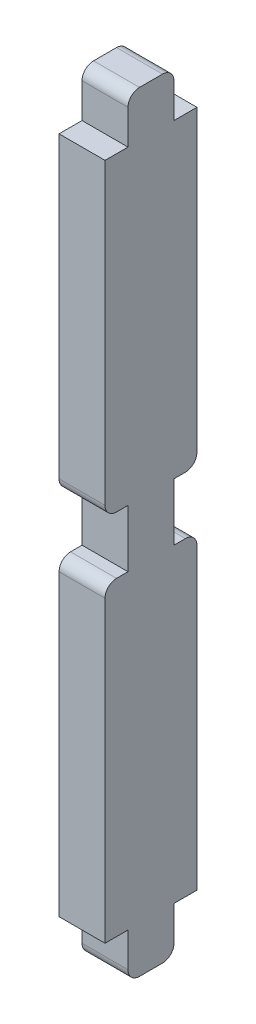
ISO-10303-21;
HEADER;
FILE_DESCRIPTION(('STEP AP214'),'2;1');
FILE_NAME('part.step','',(''),(''),'','','');
FILE_SCHEMA(('AUTOMOTIVE_DESIGN { 1 0 10303 214 1 1 1 1 }'));
ENDSEC;
DATA;
#1=APPLICATION_CONTEXT('core data for automotive mechanical design processes');
#2=APPLICATION_PROTOCOL_DEFINITION('international standard','automotive_design',2000,#1);
#3=PRODUCT_CONTEXT('',#1,'mechanical');
#4=PRODUCT('Part','Part','',(#3));
#5=PRODUCT_RELATED_PRODUCT_CATEGORY('part','',(#4));
#6=PRODUCT_DEFINITION_FORMATION('','',#4);
#7=PRODUCT_DEFINITION_CONTEXT('part definition',#1,'design');
#8=PRODUCT_DEFINITION('design','',#6,#7);
#9=PRODUCT_DEFINITION_SHAPE('','',#8);
#10=(LENGTH_UNIT() NAMED_UNIT(*) SI_UNIT(.MILLI.,.METRE.));
#11=(NAMED_UNIT(*) PLANE_ANGLE_UNIT() SI_UNIT($,.RADIAN.));
#12=(NAMED_UNIT(*) SI_UNIT($,.STERADIAN.) SOLID_ANGLE_UNIT());
#13=UNCERTAINTY_MEASURE_WITH_UNIT(LENGTH_MEASURE(1.E-05),#10,'distance_accuracy_value','');
#14=(GEOMETRIC_REPRESENTATION_CONTEXT(3) GLOBAL_UNCERTAINTY_ASSIGNED_CONTEXT((#13)) GLOBAL_UNIT_ASSIGNED_CONTEXT((#10,
#11,#12)) REPRESENTATION_CONTEXT('',''));
#15=CARTESIAN_POINT('',(0.,0.,0.));
#16=DIRECTION('',(0.,0.,1.));
#17=DIRECTION('',(1.,0.,0.));
#18=AXIS2_PLACEMENT_3D('',#15,#16,#17);
#19=CARTESIAN_POINT('',(4.,-29.5,-2.));
#20=DIRECTION('',(0.,0.,1.));
#21=DIRECTION('',(1.,0.,0.));
#22=AXIS2_PLACEMENT_3D('',#19,#20,#21);
#23=PLANE('',#22);
#24=DIRECTION('',(0.,1.,0.));
#25=VECTOR('',#24,1.);
#26=CARTESIAN_POINT('',(4.,-29.5,-2.));
#27=LINE('',#26,#25);
#28=CARTESIAN_POINT('',(4.,-32.5,-2.));
#29=VERTEX_POINT('',#28);
#30=CARTESIAN_POINT('',(4.,-29.5,-2.));
#31=VERTEX_POINT('',#30);
#32=EDGE_CURVE('E222',#29,#31,#27,.T.);
#33=ORIENTED_EDGE('',*,*,#32,.F.);
#34=DIRECTION('',(-1.,0.,0.));
#35=VECTOR('',#34,1.);
#36=CARTESIAN_POINT('',(4.,-32.5,-2.));
#37=LINE('',#36,#35);
#38=CARTESIAN_POINT('',(0.,-32.5,-2.));
#39=VERTEX_POINT('',#38);
#40=EDGE_CURVE('E309',#29,#39,#37,.T.);
#41=ORIENTED_EDGE('',*,*,#40,.T.);
#42=DIRECTION('',(0.,1.,0.));
#43=VECTOR('',#42,1.);
#44=CARTESIAN_POINT('',(0.,-29.5,-2.));
#45=LINE('',#44,#43);
#46=CARTESIAN_POINT('',(0.,-29.5,-2.));
#47=VERTEX_POINT('',#46);
#48=EDGE_CURVE('E245',#39,#47,#45,.T.);
#49=ORIENTED_EDGE('',*,*,#48,.T.);
#50=DIRECTION('',(-1.,0.,0.));
#51=VECTOR('',#50,1.);
#52=CARTESIAN_POINT('',(4.,-29.5,-2.));
#53=LINE('',#52,#51);
#54=EDGE_CURVE('E238',#31,#47,#53,.T.);
#55=ORIENTED_EDGE('',*,*,#54,.F.);
#56=EDGE_LOOP('',(#33,#41,#49,#55));
#57=FACE_BOUND('',#56,.T.);
#58=ADVANCED_FACE('F39',(#57),#23,.F.);
#59=CARTESIAN_POINT('',(4.,-29.5,-4.));
#60=DIRECTION('',(0.,1.,0.));
#61=DIRECTION('',(0.,0.,1.));
#62=AXIS2_PLACEMENT_3D('',#59,#60,#61);
#63=PLANE('',#62);
#64=DIRECTION('',(0.,0.,-1.));
#65=VECTOR('',#64,1.);
#66=CARTESIAN_POINT('',(0.,-29.5,-4.));
#67=LINE('',#66,#65);
#68=CARTESIAN_POINT('',(0.,-29.5,-4.));
#69=VERTEX_POINT('',#68);
#70=EDGE_CURVE('E471',#47,#69,#67,.T.);
#71=ORIENTED_EDGE('',*,*,#70,.T.);
#72=DIRECTION('',(-1.,0.,0.));
#73=VECTOR('',#72,1.);
#74=CARTESIAN_POINT('',(4.,-29.5,-4.));
#75=LINE('',#74,#73);
#76=CARTESIAN_POINT('',(4.,-29.5,-4.));
#77=VERTEX_POINT('',#76);
#78=EDGE_CURVE('E240',#77,#69,#75,.T.);
#79=ORIENTED_EDGE('',*,*,#78,.F.);
#80=DIRECTION('',(0.,0.,-1.));
#81=VECTOR('',#80,1.);
#82=CARTESIAN_POINT('',(4.,-29.5,-4.));
#83=LINE('',#82,#81);
#84=EDGE_CURVE('E227',#31,#77,#83,.T.);
#85=ORIENTED_EDGE('',*,*,#84,.F.);
#86=ORIENTED_EDGE('',*,*,#54,.T.);
#87=EDGE_LOOP('',(#71,#79,#85,#86));
#88=FACE_BOUND('',#87,.T.);
#89=ADVANCED_FACE('F237',(#88),#63,.F.);
#90=CARTESIAN_POINT('',(4.,-2.5,-4.));
#91=DIRECTION('',(0.,0.,1.));
#92=DIRECTION('',(0.,-1.,0.));
#93=AXIS2_PLACEMENT_3D('',#90,#91,#92);
#94=PLANE('',#93);
#95=DIRECTION('',(0.,1.,0.));
#96=VECTOR('',#95,1.);
#97=CARTESIAN_POINT('',(0.,-2.5,-4.));
#98=LINE('',#97,#96);
#99=CARTESIAN_POINT('',(0.,-3.5,-4.));
#100=VERTEX_POINT('',#99);
#101=EDGE_CURVE('E418',#69,#100,#98,.T.);
#102=ORIENTED_EDGE('',*,*,#101,.T.);
#103=DIRECTION('',(-1.,0.,0.));
#104=VECTOR('',#103,1.);
#105=CARTESIAN_POINT('',(4.,-3.5,-4.));
#106=LINE('',#105,#104);
#107=CARTESIAN_POINT('',(4.,-3.5,-4.));
#108=VERTEX_POINT('',#107);
#109=EDGE_CURVE('E276',#100,#108,#106,.F.);
#110=ORIENTED_EDGE('',*,*,#109,.T.);
#111=DIRECTION('',(0.,1.,0.));
#112=VECTOR('',#111,1.);
#113=CARTESIAN_POINT('',(4.,-2.5,-4.));
#114=LINE('',#113,#112);
#115=EDGE_CURVE('E242',#77,#108,#114,.T.);
#116=ORIENTED_EDGE('',*,*,#115,.F.);
#117=ORIENTED_EDGE('',*,*,#78,.T.);
#118=EDGE_LOOP('',(#102,#110,#116,#117));
#119=FACE_BOUND('',#118,.T.);
#120=ADVANCED_FACE('F476',(#119),#94,.F.);
#121=CARTESIAN_POINT('',(4.,-2.5,-2.));
#122=DIRECTION('',(0.,-1.,0.));
#123=DIRECTION('',(0.,0.,-1.));
#124=AXIS2_PLACEMENT_3D('',#121,#122,#123);
#125=PLANE('',#124);
#126=DIRECTION('',(0.,0.,1.));
#127=VECTOR('',#126,1.);
#128=CARTESIAN_POINT('',(4.,-2.5,-2.));
#129=LINE('',#128,#127);
#130=CARTESIAN_POINT('',(4.,-2.5,-3.));
#131=VERTEX_POINT('',#130);
#132=CARTESIAN_POINT('',(4.,-2.5,-2.));
#133=VERTEX_POINT('',#132);
#134=EDGE_CURVE('E443',#131,#133,#129,.T.);
#135=ORIENTED_EDGE('',*,*,#134,.F.);
#136=DIRECTION('',(-1.,0.,0.));
#137=VECTOR('',#136,1.);
#138=CARTESIAN_POINT('',(4.,-2.5,-3.));
#139=LINE('',#138,#137);
#140=CARTESIAN_POINT('',(0.,-2.5,-3.));
#141=VERTEX_POINT('',#140);
#142=EDGE_CURVE('E273',#131,#141,#139,.T.);
#143=ORIENTED_EDGE('',*,*,#142,.T.);
#144=DIRECTION('',(0.,0.,1.));
#145=VECTOR('',#144,1.);
#146=CARTESIAN_POINT('',(0.,-2.5,-2.));
#147=LINE('',#146,#145);
#148=CARTESIAN_POINT('',(0.,-2.5,-2.));
#149=VERTEX_POINT('',#148);
#150=EDGE_CURVE('E412',#141,#149,#147,.T.);
#151=ORIENTED_EDGE('',*,*,#150,.T.);
#152=DIRECTION('',(-1.,0.,0.));
#153=VECTOR('',#152,1.);
#154=CARTESIAN_POINT('',(4.,-2.5,-2.));
#155=LINE('',#154,#153);
#156=EDGE_CURVE('E252',#133,#149,#155,.T.);
#157=ORIENTED_EDGE('',*,*,#156,.F.);
#158=EDGE_LOOP('',(#135,#143,#151,#157));
#159=FACE_BOUND('',#158,.T.);
#160=ADVANCED_FACE('F481',(#159),#125,.F.);
#161=CARTESIAN_POINT('',(4.,2.5,-2.));
#162=DIRECTION('',(0.,0.,1.));
#163=DIRECTION('',(1.,0.,0.));
#164=AXIS2_PLACEMENT_3D('',#161,#162,#163);
#165=PLANE('',#164);
#166=DIRECTION('',(0.,1.,0.));
#167=VECTOR('',#166,1.);
#168=CARTESIAN_POINT('',(0.,2.5,-2.));
#169=LINE('',#168,#167);
#170=CARTESIAN_POINT('',(0.,2.5,-2.));
#171=VERTEX_POINT('',#170);
#172=EDGE_CURVE('E406',#149,#171,#169,.T.);
#173=ORIENTED_EDGE('',*,*,#172,.T.);
#174=DIRECTION('',(-1.,0.,0.));
#175=VECTOR('',#174,1.);
#176=CARTESIAN_POINT('',(4.,2.5,-2.));
#177=LINE('',#176,#175);
#178=CARTESIAN_POINT('',(4.,2.5,-2.));
#179=VERTEX_POINT('',#178);
#180=EDGE_CURVE('E397',#179,#171,#177,.T.);
#181=ORIENTED_EDGE('',*,*,#180,.F.);
#182=DIRECTION('',(0.,1.,0.));
#183=VECTOR('',#182,1.);
#184=CARTESIAN_POINT('',(4.,2.5,-2.));
#185=LINE('',#184,#183);
#186=EDGE_CURVE('E407',#133,#179,#185,.T.);
#187=ORIENTED_EDGE('',*,*,#186,.F.);
#188=ORIENTED_EDGE('',*,*,#156,.T.);
#189=EDGE_LOOP('',(#173,#181,#187,#188));
#190=FACE_BOUND('',#189,.T.);
#191=ADVANCED_FACE('F404',(#190),#165,.F.);
#192=CARTESIAN_POINT('',(4.,2.5,-4.));
#193=DIRECTION('',(0.,1.,0.));
#194=DIRECTION('',(0.,0.,1.));
#195=AXIS2_PLACEMENT_3D('',#192,#193,#194);
#196=PLANE('',#195);
#197=DIRECTION('',(0.,0.,-1.));
#198=VECTOR('',#197,1.);
#199=CARTESIAN_POINT('',(0.,2.5,-4.));
#200=LINE('',#199,#198);
#201=CARTESIAN_POINT('',(0.,2.5,-3.));
#202=VERTEX_POINT('',#201);
#203=EDGE_CURVE('E414',#171,#202,#200,.T.);
#204=ORIENTED_EDGE('',*,*,#203,.T.);
#205=DIRECTION('',(-1.,0.,0.));
#206=VECTOR('',#205,1.);
#207=CARTESIAN_POINT('',(4.,2.5,-3.));
#208=LINE('',#207,#206);
#209=CARTESIAN_POINT('',(4.,2.5,-3.));
#210=VERTEX_POINT('',#209);
#211=EDGE_CURVE('E263',#202,#210,#208,.F.);
#212=ORIENTED_EDGE('',*,*,#211,.T.);
#213=DIRECTION('',(0.,0.,-1.));
#214=VECTOR('',#213,1.);
#215=CARTESIAN_POINT('',(4.,2.5,-4.));
#216=LINE('',#215,#214);
#217=EDGE_CURVE('E440',#179,#210,#216,.T.);
#218=ORIENTED_EDGE('',*,*,#217,.F.);
#219=ORIENTED_EDGE('',*,*,#180,.T.);
#220=EDGE_LOOP('',(#204,#212,#218,#219));
#221=FACE_BOUND('',#220,.T.);
#222=ADVANCED_FACE('F439',(#221),#196,.F.);
#223=CARTESIAN_POINT('',(4.,29.5,-4.));
#224=DIRECTION('',(0.,0.,1.));
#225=DIRECTION('',(1.,0.,0.));
#226=AXIS2_PLACEMENT_3D('',#223,#224,#225);
#227=PLANE('',#226);
#228=DIRECTION('',(0.,1.,0.));
#229=VECTOR('',#228,1.);
#230=CARTESIAN_POINT('',(4.,29.5,-4.));
#231=LINE('',#230,#229);
#232=CARTESIAN_POINT('',(4.,3.5,-4.));
#233=VERTEX_POINT('',#232);
#234=CARTESIAN_POINT('',(4.,29.5,-4.));
#235=VERTEX_POINT('',#234);
#236=EDGE_CURVE('E431',#233,#235,#231,.T.);
#237=ORIENTED_EDGE('',*,*,#236,.F.);
#238=DIRECTION('',(-1.,0.,0.));
#239=VECTOR('',#238,1.);
#240=CARTESIAN_POINT('',(4.,3.5,-4.));
#241=LINE('',#240,#239);
#242=CARTESIAN_POINT('',(0.,3.5,-4.));
#243=VERTEX_POINT('',#242);
#244=EDGE_CURVE('E247',#233,#243,#241,.T.);
#245=ORIENTED_EDGE('',*,*,#244,.T.);
#246=DIRECTION('',(0.,1.,0.));
#247=VECTOR('',#246,1.);
#248=CARTESIAN_POINT('',(0.,29.5,-4.));
#249=LINE('',#248,#247);
#250=CARTESIAN_POINT('',(0.,29.5,-4.));
#251=VERTEX_POINT('',#250);
#252=EDGE_CURVE('E416',#243,#251,#249,.T.);
#253=ORIENTED_EDGE('',*,*,#252,.T.);
#254=DIRECTION('',(-1.,0.,0.));
#255=VECTOR('',#254,1.);
#256=CARTESIAN_POINT('',(4.,29.5,-4.));
#257=LINE('',#256,#255);
#258=EDGE_CURVE('E394',#235,#251,#257,.T.);
#259=ORIENTED_EDGE('',*,*,#258,.F.);
#260=EDGE_LOOP('',(#237,#245,#253,#259));
#261=FACE_BOUND('',#260,.T.);
#262=ADVANCED_FACE('F429',(#261),#227,.F.);
#263=CARTESIAN_POINT('',(4.,29.5,-2.));
#264=DIRECTION('',(0.,-1.,0.));
#265=DIRECTION('',(0.,0.,-1.));
#266=AXIS2_PLACEMENT_3D('',#263,#264,#265);
#267=PLANE('',#266);
#268=DIRECTION('',(0.,0.,1.));
#269=VECTOR('',#268,1.);
#270=CARTESIAN_POINT('',(0.,29.5,-2.));
#271=LINE('',#270,#269);
#272=CARTESIAN_POINT('',(0.,29.5,-2.));
#273=VERTEX_POINT('',#272);
#274=EDGE_CURVE('E349',#251,#273,#271,.T.);
#275=ORIENTED_EDGE('',*,*,#274,.T.);
#276=DIRECTION('',(-1.,0.,0.));
#277=VECTOR('',#276,1.);
#278=CARTESIAN_POINT('',(4.,29.5,-2.));
#279=LINE('',#278,#277);
#280=CARTESIAN_POINT('',(4.,29.5,-2.));
#281=VERTEX_POINT('',#280);
#282=EDGE_CURVE('E392',#281,#273,#279,.T.);
#283=ORIENTED_EDGE('',*,*,#282,.F.);
#284=DIRECTION('',(0.,0.,1.));
#285=VECTOR('',#284,1.);
#286=CARTESIAN_POINT('',(4.,29.5,-2.));
#287=LINE('',#286,#285);
#288=EDGE_CURVE('E329',#235,#281,#287,.T.);
#289=ORIENTED_EDGE('',*,*,#288,.F.);
#290=ORIENTED_EDGE('',*,*,#258,.T.);
#291=EDGE_LOOP('',(#275,#283,#289,#290));
#292=FACE_BOUND('',#291,.T.);
#293=ADVANCED_FACE('F424',(#292),#267,.F.);
#294=CARTESIAN_POINT('',(4.,33.5,-2.));
#295=DIRECTION('',(0.,0.,1.));
#296=DIRECTION('',(1.,0.,0.));
#297=AXIS2_PLACEMENT_3D('',#294,#295,#296);
#298=PLANE('',#297);
#299=DIRECTION('',(0.,1.,0.));
#300=VECTOR('',#299,1.);
#301=CARTESIAN_POINT('',(0.,33.5,-2.));
#302=LINE('',#301,#300);
#303=CARTESIAN_POINT('',(0.,32.5,-2.));
#304=VERTEX_POINT('',#303);
#305=EDGE_CURVE('E324',#273,#304,#302,.T.);
#306=ORIENTED_EDGE('',*,*,#305,.T.);
#307=DIRECTION('',(-1.,0.,0.));
#308=VECTOR('',#307,1.);
#309=CARTESIAN_POINT('',(4.,32.5,-2.));
#310=LINE('',#309,#308);
#311=CARTESIAN_POINT('',(4.,32.5,-2.));
#312=VERTEX_POINT('',#311);
#313=EDGE_CURVE('E47',#304,#312,#310,.F.);
#314=ORIENTED_EDGE('',*,*,#313,.T.);
#315=DIRECTION('',(0.,1.,0.));
#316=VECTOR('',#315,1.);
#317=CARTESIAN_POINT('',(4.,33.5,-2.));
#318=LINE('',#317,#316);
#319=EDGE_CURVE('E322',#281,#312,#318,.T.);
#320=ORIENTED_EDGE('',*,*,#319,.F.);
#321=ORIENTED_EDGE('',*,*,#282,.T.);
#322=EDGE_LOOP('',(#306,#314,#320,#321));
#323=FACE_BOUND('',#322,.T.);
#324=ADVANCED_FACE('F320',(#323),#298,.F.);
#325=CARTESIAN_POINT('',(4.,33.5,2.));
#326=DIRECTION('',(0.,-1.,0.));
#327=DIRECTION('',(0.,0.,-1.));
#328=AXIS2_PLACEMENT_3D('',#325,#326,#327);
#329=PLANE('',#328);
#330=DIRECTION('',(0.,0.,1.));
#331=VECTOR('',#330,1.);
#332=CARTESIAN_POINT('',(4.,33.5,2.));
#333=LINE('',#332,#331);
#334=CARTESIAN_POINT('',(4.,33.5,-1.));
#335=VERTEX_POINT('',#334);
#336=CARTESIAN_POINT('',(4.,33.5,0.999999999999998));
#337=VERTEX_POINT('',#336);
#338=EDGE_CURVE('E331',#335,#337,#333,.T.);
#339=ORIENTED_EDGE('',*,*,#338,.F.);
#340=DIRECTION('',(-1.,0.,0.));
#341=VECTOR('',#340,1.);
#342=CARTESIAN_POINT('',(4.,33.5,-1.));
#343=LINE('',#342,#341);
#344=CARTESIAN_POINT('',(0.,33.5,-1.));
#345=VERTEX_POINT('',#344);
#346=EDGE_CURVE('E313',#335,#345,#343,.T.);
#347=ORIENTED_EDGE('',*,*,#346,.T.);
#348=DIRECTION('',(0.,0.,1.));
#349=VECTOR('',#348,1.);
#350=CARTESIAN_POINT('',(0.,33.5,2.));
#351=LINE('',#350,#349);
#352=CARTESIAN_POINT('',(0.,33.5,0.999999999999998));
#353=VERTEX_POINT('',#352);
#354=EDGE_CURVE('E339',#345,#353,#351,.T.);
#355=ORIENTED_EDGE('',*,*,#354,.T.);
#356=DIRECTION('',(-1.,0.,0.));
#357=VECTOR('',#356,1.);
#358=CARTESIAN_POINT('',(4.,33.5,0.999999999999998));
#359=LINE('',#358,#357);
#360=EDGE_CURVE('E311',#353,#337,#359,.F.);
#361=ORIENTED_EDGE('',*,*,#360,.T.);
#362=EDGE_LOOP('',(#339,#347,#355,#361));
#363=FACE_BOUND('',#362,.T.);
#364=ADVANCED_FACE('F338',(#363),#329,.F.);
#365=CARTESIAN_POINT('',(4.,29.5,2.));
#366=DIRECTION('',(0.,0.,-1.));
#367=DIRECTION('',(-1.,0.,0.));
#368=AXIS2_PLACEMENT_3D('',#365,#366,#367);
#369=PLANE('',#368);
#370=DIRECTION('',(0.,-1.,0.));
#371=VECTOR('',#370,1.);
#372=CARTESIAN_POINT('',(4.,29.5,2.));
#373=LINE('',#372,#371);
#374=CARTESIAN_POINT('',(4.,32.5,2.));
#375=VERTEX_POINT('',#374);
#376=CARTESIAN_POINT('',(4.,29.5,2.));
#377=VERTEX_POINT('',#376);
#378=EDGE_CURVE('E449',#375,#377,#373,.T.);
#379=ORIENTED_EDGE('',*,*,#378,.F.);
#380=DIRECTION('',(-1.,0.,0.));
#381=VECTOR('',#380,1.);
#382=CARTESIAN_POINT('',(4.,32.5,2.));
#383=LINE('',#382,#381);
#384=CARTESIAN_POINT('',(0.,32.5,2.));
#385=VERTEX_POINT('',#384);
#386=EDGE_CURVE('E11',#375,#385,#383,.T.);
#387=ORIENTED_EDGE('',*,*,#386,.T.);
#388=DIRECTION('',(0.,-1.,0.));
#389=VECTOR('',#388,1.);
#390=CARTESIAN_POINT('',(0.,29.5,2.));
#391=LINE('',#390,#389);
#392=CARTESIAN_POINT('',(0.,29.5,2.));
#393=VERTEX_POINT('',#392);
#394=EDGE_CURVE('E345',#385,#393,#391,.T.);
#395=ORIENTED_EDGE('',*,*,#394,.T.);
#396=DIRECTION('',(-1.,0.,0.));
#397=VECTOR('',#396,1.);
#398=CARTESIAN_POINT('',(4.,29.5,2.));
#399=LINE('',#398,#397);
#400=EDGE_CURVE('E389',#377,#393,#399,.T.);
#401=ORIENTED_EDGE('',*,*,#400,.F.);
#402=EDGE_LOOP('',(#379,#387,#395,#401));
#403=FACE_BOUND('',#402,.T.);
#404=ADVANCED_FACE('F528',(#403),#369,.F.);
#405=CARTESIAN_POINT('',(4.,29.5,4.));
#406=DIRECTION('',(0.,-1.,0.));
#407=DIRECTION('',(0.,0.,-1.));
#408=AXIS2_PLACEMENT_3D('',#405,#406,#407);
#409=PLANE('',#408);
#410=DIRECTION('',(0.,0.,1.));
#411=VECTOR('',#410,1.);
#412=CARTESIAN_POINT('',(0.,29.5,4.));
#413=LINE('',#412,#411);
#414=CARTESIAN_POINT('',(0.,29.5,4.));
#415=VERTEX_POINT('',#414);
#416=EDGE_CURVE('E347',#393,#415,#413,.T.);
#417=ORIENTED_EDGE('',*,*,#416,.T.);
#418=DIRECTION('',(-1.,0.,0.));
#419=VECTOR('',#418,1.);
#420=CARTESIAN_POINT('',(4.,29.5,4.));
#421=LINE('',#420,#419);
#422=CARTESIAN_POINT('',(4.,29.5,4.));
#423=VERTEX_POINT('',#422);
#424=EDGE_CURVE('E386',#423,#415,#421,.T.);
#425=ORIENTED_EDGE('',*,*,#424,.F.);
#426=DIRECTION('',(0.,0.,1.));
#427=VECTOR('',#426,1.);
#428=CARTESIAN_POINT('',(4.,29.5,4.));
#429=LINE('',#428,#427);
#430=EDGE_CURVE('E451',#377,#423,#429,.T.);
#431=ORIENTED_EDGE('',*,*,#430,.F.);
#432=ORIENTED_EDGE('',*,*,#400,.T.);
#433=EDGE_LOOP('',(#417,#425,#431,#432));
#434=FACE_BOUND('',#433,.T.);
#435=ADVANCED_FACE('F534',(#434),#409,.F.);
#436=CARTESIAN_POINT('',(4.,2.5,4.));
#437=DIRECTION('',(0.,0.,-1.));
#438=DIRECTION('',(-1.,0.,0.));
#439=AXIS2_PLACEMENT_3D('',#436,#437,#438);
#440=PLANE('',#439);
#441=DIRECTION('',(0.,-1.,0.));
#442=VECTOR('',#441,1.);
#443=CARTESIAN_POINT('',(0.,2.5,4.));
#444=LINE('',#443,#442);
#445=CARTESIAN_POINT('',(0.,3.5,4.));
#446=VERTEX_POINT('',#445);
#447=EDGE_CURVE('E354',#415,#446,#444,.T.);
#448=ORIENTED_EDGE('',*,*,#447,.T.);
#449=DIRECTION('',(-1.,0.,0.));
#450=VECTOR('',#449,1.);
#451=CARTESIAN_POINT('',(4.,3.5,4.));
#452=LINE('',#451,#450);
#453=CARTESIAN_POINT('',(4.,3.5,4.));
#454=VERTEX_POINT('',#453);
#455=EDGE_CURVE('E281',#446,#454,#452,.F.);
#456=ORIENTED_EDGE('',*,*,#455,.T.);
#457=DIRECTION('',(0.,-1.,0.));
#458=VECTOR('',#457,1.);
#459=CARTESIAN_POINT('',(4.,2.5,4.));
#460=LINE('',#459,#458);
#461=EDGE_CURVE('E453',#423,#454,#460,.T.);
#462=ORIENTED_EDGE('',*,*,#461,.F.);
#463=ORIENTED_EDGE('',*,*,#424,.T.);
#464=EDGE_LOOP('',(#448,#456,#462,#463));
#465=FACE_BOUND('',#464,.T.);
#466=ADVANCED_FACE('F538',(#465),#440,.F.);
#467=CARTESIAN_POINT('',(4.,2.5,2.));
#468=DIRECTION('',(0.,1.,0.));
#469=DIRECTION('',(0.,0.,1.));
#470=AXIS2_PLACEMENT_3D('',#467,#468,#469);
#471=PLANE('',#470);
#472=DIRECTION('',(0.,0.,-1.));
#473=VECTOR('',#472,1.);
#474=CARTESIAN_POINT('',(4.,2.5,2.));
#475=LINE('',#474,#473);
#476=CARTESIAN_POINT('',(4.,2.5,3.));
#477=VERTEX_POINT('',#476);
#478=CARTESIAN_POINT('',(4.,2.5,2.));
#479=VERTEX_POINT('',#478);
#480=EDGE_CURVE('E456',#477,#479,#475,.T.);
#481=ORIENTED_EDGE('',*,*,#480,.F.);
#482=DIRECTION('',(-1.,0.,0.));
#483=VECTOR('',#482,1.);
#484=CARTESIAN_POINT('',(4.,2.5,3.));
#485=LINE('',#484,#483);
#486=CARTESIAN_POINT('',(0.,2.5,3.));
#487=VERTEX_POINT('',#486);
#488=EDGE_CURVE('E278',#477,#487,#485,.T.);
#489=ORIENTED_EDGE('',*,*,#488,.T.);
#490=DIRECTION('',(0.,0.,-1.));
#491=VECTOR('',#490,1.);
#492=CARTESIAN_POINT('',(0.,2.5,2.));
#493=LINE('',#492,#491);
#494=CARTESIAN_POINT('',(0.,2.5,2.));
#495=VERTEX_POINT('',#494);
#496=EDGE_CURVE('E357',#487,#495,#493,.T.);
#497=ORIENTED_EDGE('',*,*,#496,.T.);
#498=DIRECTION('',(-1.,0.,0.));
#499=VECTOR('',#498,1.);
#500=CARTESIAN_POINT('',(4.,2.5,2.));
#501=LINE('',#500,#499);
#502=EDGE_CURVE('E383',#479,#495,#501,.T.);
#503=ORIENTED_EDGE('',*,*,#502,.F.);
#504=EDGE_LOOP('',(#481,#489,#497,#503));
#505=FACE_BOUND('',#504,.T.);
#506=ADVANCED_FACE('F545',(#505),#471,.F.);
#507=CARTESIAN_POINT('',(4.,-2.5,2.));
#508=DIRECTION('',(0.,0.,-1.));
#509=DIRECTION('',(-1.,0.,0.));
#510=AXIS2_PLACEMENT_3D('',#507,#508,#509);
#511=PLANE('',#510);
#512=DIRECTION('',(0.,-1.,0.));
#513=VECTOR('',#512,1.);
#514=CARTESIAN_POINT('',(0.,-2.5,2.));
#515=LINE('',#514,#513);
#516=CARTESIAN_POINT('',(0.,-2.5,2.));
#517=VERTEX_POINT('',#516);
#518=EDGE_CURVE('E359',#495,#517,#515,.T.);
#519=ORIENTED_EDGE('',*,*,#518,.T.);
#520=DIRECTION('',(-1.,0.,0.));
#521=VECTOR('',#520,1.);
#522=CARTESIAN_POINT('',(4.,-2.5,2.));
#523=LINE('',#522,#521);
#524=CARTESIAN_POINT('',(4.,-2.5,2.));
#525=VERTEX_POINT('',#524);
#526=EDGE_CURVE('E380',#525,#517,#523,.T.);
#527=ORIENTED_EDGE('',*,*,#526,.F.);
#528=DIRECTION('',(0.,-1.,0.));
#529=VECTOR('',#528,1.);
#530=CARTESIAN_POINT('',(4.,-2.5,2.));
#531=LINE('',#530,#529);
#532=EDGE_CURVE('E458',#479,#525,#531,.T.);
#533=ORIENTED_EDGE('',*,*,#532,.F.);
#534=ORIENTED_EDGE('',*,*,#502,.T.);
#535=EDGE_LOOP('',(#519,#527,#533,#534));
#536=FACE_BOUND('',#535,.T.);
#537=ADVANCED_FACE('F551',(#536),#511,.F.);
#538=CARTESIAN_POINT('',(4.,-2.5,4.));
#539=DIRECTION('',(0.,-1.,0.));
#540=DIRECTION('',(0.,0.,-1.));
#541=AXIS2_PLACEMENT_3D('',#538,#539,#540);
#542=PLANE('',#541);
#543=DIRECTION('',(0.,0.,1.));
#544=VECTOR('',#543,1.);
#545=CARTESIAN_POINT('',(0.,-2.5,4.));
#546=LINE('',#545,#544);
#547=CARTESIAN_POINT('',(0.,-2.5,3.));
#548=VERTEX_POINT('',#547);
#549=EDGE_CURVE('E361',#517,#548,#546,.T.);
#550=ORIENTED_EDGE('',*,*,#549,.T.);
#551=DIRECTION('',(-1.,0.,0.));
#552=VECTOR('',#551,1.);
#553=CARTESIAN_POINT('',(4.,-2.5,3.));
#554=LINE('',#553,#552);
#555=CARTESIAN_POINT('',(4.,-2.5,3.));
#556=VERTEX_POINT('',#555);
#557=EDGE_CURVE('E286',#548,#556,#554,.F.);
#558=ORIENTED_EDGE('',*,*,#557,.T.);
#559=DIRECTION('',(0.,0.,1.));
#560=VECTOR('',#559,1.);
#561=CARTESIAN_POINT('',(4.,-2.5,4.));
#562=LINE('',#561,#560);
#563=EDGE_CURVE('E460',#525,#556,#562,.T.);
#564=ORIENTED_EDGE('',*,*,#563,.F.);
#565=ORIENTED_EDGE('',*,*,#526,.T.);
#566=EDGE_LOOP('',(#550,#558,#564,#565));
#567=FACE_BOUND('',#566,.T.);
#568=ADVANCED_FACE('F555',(#567),#542,.F.);
#569=CARTESIAN_POINT('',(4.,-29.5,4.));
#570=DIRECTION('',(0.,0.,-1.));
#571=DIRECTION('',(-1.,0.,0.));
#572=AXIS2_PLACEMENT_3D('',#569,#570,#571);
#573=PLANE('',#572);
#574=DIRECTION('',(0.,-1.,0.));
#575=VECTOR('',#574,1.);
#576=CARTESIAN_POINT('',(4.,-29.5,4.));
#577=LINE('',#576,#575);
#578=CARTESIAN_POINT('',(4.,-3.5,4.));
#579=VERTEX_POINT('',#578);
#580=CARTESIAN_POINT('',(4.,-29.5,4.));
#581=VERTEX_POINT('',#580);
#582=EDGE_CURVE('E463',#579,#581,#577,.T.);
#583=ORIENTED_EDGE('',*,*,#582,.F.);
#584=DIRECTION('',(-1.,0.,0.));
#585=VECTOR('',#584,1.);
#586=CARTESIAN_POINT('',(4.,-3.5,4.));
#587=LINE('',#586,#585);
#588=CARTESIAN_POINT('',(0.,-3.5,4.));
#589=VERTEX_POINT('',#588);
#590=EDGE_CURVE('E283',#579,#589,#587,.T.);
#591=ORIENTED_EDGE('',*,*,#590,.T.);
#592=DIRECTION('',(0.,-1.,0.));
#593=VECTOR('',#592,1.);
#594=CARTESIAN_POINT('',(0.,-29.5,4.));
#595=LINE('',#594,#593);
#596=CARTESIAN_POINT('',(0.,-29.5,4.));
#597=VERTEX_POINT('',#596);
#598=EDGE_CURVE('E364',#589,#597,#595,.T.);
#599=ORIENTED_EDGE('',*,*,#598,.T.);
#600=DIRECTION('',(-1.,0.,0.));
#601=VECTOR('',#600,1.);
#602=CARTESIAN_POINT('',(4.,-29.5,4.));
#603=LINE('',#602,#601);
#604=EDGE_CURVE('E376',#581,#597,#603,.T.);
#605=ORIENTED_EDGE('',*,*,#604,.F.);
#606=EDGE_LOOP('',(#583,#591,#599,#605));
#607=FACE_BOUND('',#606,.T.);
#608=ADVANCED_FACE('F562',(#607),#573,.F.);
#609=CARTESIAN_POINT('',(4.,-29.5,2.));
#610=DIRECTION('',(0.,1.,0.));
#611=DIRECTION('',(0.,0.,1.));
#612=AXIS2_PLACEMENT_3D('',#609,#610,#611);
#613=PLANE('',#612);
#614=DIRECTION('',(0.,0.,-1.));
#615=VECTOR('',#614,1.);
#616=CARTESIAN_POINT('',(0.,-29.5,2.));
#617=LINE('',#616,#615);
#618=CARTESIAN_POINT('',(0.,-29.5,2.));
#619=VERTEX_POINT('',#618);
#620=EDGE_CURVE('E366',#597,#619,#617,.T.);
#621=ORIENTED_EDGE('',*,*,#620,.T.);
#622=DIRECTION('',(-1.,0.,0.));
#623=VECTOR('',#622,1.);
#624=CARTESIAN_POINT('',(4.,-29.5,2.));
#625=LINE('',#624,#623);
#626=CARTESIAN_POINT('',(4.,-29.5,2.));
#627=VERTEX_POINT('',#626);
#628=EDGE_CURVE('E373',#627,#619,#625,.T.);
#629=ORIENTED_EDGE('',*,*,#628,.F.);
#630=DIRECTION('',(0.,0.,-1.));
#631=VECTOR('',#630,1.);
#632=CARTESIAN_POINT('',(4.,-29.5,2.));
#633=LINE('',#632,#631);
#634=EDGE_CURVE('E465',#581,#627,#633,.T.);
#635=ORIENTED_EDGE('',*,*,#634,.F.);
#636=ORIENTED_EDGE('',*,*,#604,.T.);
#637=EDGE_LOOP('',(#621,#629,#635,#636));
#638=FACE_BOUND('',#637,.T.);
#639=ADVANCED_FACE('F568',(#638),#613,.F.);
#640=CARTESIAN_POINT('',(4.,-33.5,2.));
#641=DIRECTION('',(0.,0.,-1.));
#642=DIRECTION('',(-1.,0.,0.));
#643=AXIS2_PLACEMENT_3D('',#640,#641,#642);
#644=PLANE('',#643);
#645=DIRECTION('',(0.,-1.,0.));
#646=VECTOR('',#645,1.);
#647=CARTESIAN_POINT('',(0.,-33.5,2.));
#648=LINE('',#647,#646);
#649=CARTESIAN_POINT('',(0.,-32.5,2.));
#650=VERTEX_POINT('',#649);
#651=EDGE_CURVE('E368',#619,#650,#648,.T.);
#652=ORIENTED_EDGE('',*,*,#651,.T.);
#653=DIRECTION('',(-1.,0.,0.));
#654=VECTOR('',#653,1.);
#655=CARTESIAN_POINT('',(4.,-32.5,2.));
#656=LINE('',#655,#654);
#657=CARTESIAN_POINT('',(4.,-32.5,2.));
#658=VERTEX_POINT('',#657);
#659=EDGE_CURVE('E301',#650,#658,#656,.F.);
#660=ORIENTED_EDGE('',*,*,#659,.T.);
#661=DIRECTION('',(0.,-1.,0.));
#662=VECTOR('',#661,1.);
#663=CARTESIAN_POINT('',(4.,-33.5,2.));
#664=LINE('',#663,#662);
#665=EDGE_CURVE('E467',#627,#658,#664,.T.);
#666=ORIENTED_EDGE('',*,*,#665,.F.);
#667=ORIENTED_EDGE('',*,*,#628,.T.);
#668=EDGE_LOOP('',(#652,#660,#666,#667));
#669=FACE_BOUND('',#668,.T.);
#670=ADVANCED_FACE('F572',(#669),#644,.F.);
#671=CARTESIAN_POINT('',(4.,-33.5,-2.));
#672=DIRECTION('',(0.,1.,0.));
#673=DIRECTION('',(0.,0.,1.));
#674=AXIS2_PLACEMENT_3D('',#671,#672,#673);
#675=PLANE('',#674);
#676=DIRECTION('',(0.,0.,-1.));
#677=VECTOR('',#676,1.);
#678=CARTESIAN_POINT('',(4.,-33.5,-2.));
#679=LINE('',#678,#677);
#680=CARTESIAN_POINT('',(4.,-33.5,0.999999999999998));
#681=VERTEX_POINT('',#680);
#682=CARTESIAN_POINT('',(4.,-33.5,-1.));
#683=VERTEX_POINT('',#682);
#684=EDGE_CURVE('E377',#681,#683,#679,.T.);
#685=ORIENTED_EDGE('',*,*,#684,.F.);
#686=DIRECTION('',(-1.,0.,0.));
#687=VECTOR('',#686,1.);
#688=CARTESIAN_POINT('',(4.,-33.5,0.999999999999998));
#689=LINE('',#688,#687);
#690=CARTESIAN_POINT('',(0.,-33.5,0.999999999999998));
#691=VERTEX_POINT('',#690);
#692=EDGE_CURVE('E290',#681,#691,#689,.T.);
#693=ORIENTED_EDGE('',*,*,#692,.T.);
#694=DIRECTION('',(0.,0.,-1.));
#695=VECTOR('',#694,1.);
#696=CARTESIAN_POINT('',(0.,-33.5,-2.));
#697=LINE('',#696,#695);
#698=CARTESIAN_POINT('',(0.,-33.5,-1.));
#699=VERTEX_POINT('',#698);
#700=EDGE_CURVE('E233',#691,#699,#697,.T.);
#701=ORIENTED_EDGE('',*,*,#700,.T.);
#702=DIRECTION('',(-1.,0.,0.));
#703=VECTOR('',#702,1.);
#704=CARTESIAN_POINT('',(4.,-33.5,-1.));
#705=LINE('',#704,#703);
#706=EDGE_CURVE('E288',#699,#683,#705,.F.);
#707=ORIENTED_EDGE('',*,*,#706,.T.);
#708=EDGE_LOOP('',(#685,#693,#701,#707));
#709=FACE_BOUND('',#708,.T.);
#710=ADVANCED_FACE('F578',(#709),#675,.F.);
#711=CARTESIAN_POINT('',(4.,0.,0.));
#712=DIRECTION('',(-1.,0.,0.));
#713=DIRECTION('',(0.,0.,1.));
#714=AXIS2_PLACEMENT_3D('',#711,#712,#713);
#715=PLANE('',#714);
#716=ORIENTED_EDGE('',*,*,#665,.T.);
#717=CARTESIAN_POINT('',(4.,-32.5,0.999999999999998));
#718=DIRECTION('',(-1.,0.,0.));
#719=DIRECTION('',(0.,0.,1.));
#720=AXIS2_PLACEMENT_3D('',#717,#718,#719);
#721=CIRCLE('',#720,1.);
#722=EDGE_CURVE('E307',#658,#681,#721,.F.);
#723=ORIENTED_EDGE('',*,*,#722,.T.);
#724=ORIENTED_EDGE('',*,*,#684,.T.);
#725=CARTESIAN_POINT('',(4.,-32.5,-1.));
#726=DIRECTION('',(-1.,0.,0.));
#727=DIRECTION('',(0.,0.,1.));
#728=AXIS2_PLACEMENT_3D('',#725,#726,#727);
#729=CIRCLE('',#728,1.);
#730=EDGE_CURVE('E54',#683,#29,#729,.F.);
#731=ORIENTED_EDGE('',*,*,#730,.T.);
#732=ORIENTED_EDGE('',*,*,#32,.T.);
#733=ORIENTED_EDGE('',*,*,#84,.T.);
#734=ORIENTED_EDGE('',*,*,#115,.T.);
#735=CARTESIAN_POINT('',(4.,-3.5,-3.));
#736=DIRECTION('',(-1.,0.,0.));
#737=DIRECTION('',(0.,0.,1.));
#738=AXIS2_PLACEMENT_3D('',#735,#736,#737);
#739=CIRCLE('',#738,1.);
#740=EDGE_CURVE('E269',#108,#131,#739,.F.);
#741=ORIENTED_EDGE('',*,*,#740,.T.);
#742=ORIENTED_EDGE('',*,*,#134,.T.);
#743=ORIENTED_EDGE('',*,*,#186,.T.);
#744=ORIENTED_EDGE('',*,*,#217,.T.);
#745=CARTESIAN_POINT('',(4.,3.5,-3.));
#746=DIRECTION('',(-1.,0.,0.));
#747=DIRECTION('',(0.,0.,1.));
#748=AXIS2_PLACEMENT_3D('',#745,#746,#747);
#749=CIRCLE('',#748,1.);
#750=EDGE_CURVE('E271',#210,#233,#749,.F.);
#751=ORIENTED_EDGE('',*,*,#750,.T.);
#752=ORIENTED_EDGE('',*,*,#236,.T.);
#753=ORIENTED_EDGE('',*,*,#288,.T.);
#754=ORIENTED_EDGE('',*,*,#319,.T.);
#755=CARTESIAN_POINT('',(4.,32.5,-1.));
#756=DIRECTION('',(-1.,0.,0.));
#757=DIRECTION('',(0.,0.,1.));
#758=AXIS2_PLACEMENT_3D('',#755,#756,#757);
#759=CIRCLE('',#758,1.);
#760=EDGE_CURVE('E304',#312,#335,#759,.F.);
#761=ORIENTED_EDGE('',*,*,#760,.T.);
#762=ORIENTED_EDGE('',*,*,#338,.T.);
#763=CARTESIAN_POINT('',(4.,32.5,0.999999999999998));
#764=DIRECTION('',(-1.,0.,0.));
#765=DIRECTION('',(0.,0.,1.));
#766=AXIS2_PLACEMENT_3D('',#763,#764,#765);
#767=CIRCLE('',#766,1.);
#768=EDGE_CURVE('E61',#337,#375,#767,.F.);
#769=ORIENTED_EDGE('',*,*,#768,.T.);
#770=ORIENTED_EDGE('',*,*,#378,.T.);
#771=ORIENTED_EDGE('',*,*,#430,.T.);
#772=ORIENTED_EDGE('',*,*,#461,.T.);
#773=CARTESIAN_POINT('',(4.,3.5,3.));
#774=DIRECTION('',(-1.,0.,0.));
#775=DIRECTION('',(0.,0.,1.));
#776=AXIS2_PLACEMENT_3D('',#773,#774,#775);
#777=CIRCLE('',#776,1.);
#778=EDGE_CURVE('E267',#454,#477,#777,.F.);
#779=ORIENTED_EDGE('',*,*,#778,.T.);
#780=ORIENTED_EDGE('',*,*,#480,.T.);
#781=ORIENTED_EDGE('',*,*,#532,.T.);
#782=ORIENTED_EDGE('',*,*,#563,.T.);
#783=CARTESIAN_POINT('',(4.,-3.5,3.));
#784=DIRECTION('',(-1.,0.,0.));
#785=DIRECTION('',(0.,0.,1.));
#786=AXIS2_PLACEMENT_3D('',#783,#784,#785);
#787=CIRCLE('',#786,1.);
#788=EDGE_CURVE('E265',#556,#579,#787,.F.);
#789=ORIENTED_EDGE('',*,*,#788,.T.);
#790=ORIENTED_EDGE('',*,*,#582,.T.);
#791=ORIENTED_EDGE('',*,*,#634,.T.);
#792=EDGE_LOOP('',(#716,#723,#724,#731,#732,#733,#734,#741,#742,#743,#744,#751,#752,#753,#754,
#761,#762,#769,#770,#771,#772,#779,#780,#781,#782,#789,#790,#791));
#793=FACE_BOUND('',#792,.T.);
#794=ADVANCED_FACE('F225',(#793),#715,.F.);
#795=CARTESIAN_POINT('',(0.,0.,0.));
#796=DIRECTION('',(-1.,0.,0.));
#797=DIRECTION('',(0.,0.,1.));
#798=AXIS2_PLACEMENT_3D('',#795,#796,#797);
#799=PLANE('',#798);
#800=ORIENTED_EDGE('',*,*,#700,.F.);
#801=CARTESIAN_POINT('',(0.,-32.5,0.999999999999998));
#802=DIRECTION('',(-1.,0.,0.));
#803=DIRECTION('',(0.,0.,1.));
#804=AXIS2_PLACEMENT_3D('',#801,#802,#803);
#805=CIRCLE('',#804,1.);
#806=EDGE_CURVE('E299',#691,#650,#805,.T.);
#807=ORIENTED_EDGE('',*,*,#806,.T.);
#808=ORIENTED_EDGE('',*,*,#651,.F.);
#809=ORIENTED_EDGE('',*,*,#620,.F.);
#810=ORIENTED_EDGE('',*,*,#598,.F.);
#811=CARTESIAN_POINT('',(0.,-3.5,3.));
#812=DIRECTION('',(-1.,0.,0.));
#813=DIRECTION('',(0.,0.,1.));
#814=AXIS2_PLACEMENT_3D('',#811,#812,#813);
#815=CIRCLE('',#814,1.);
#816=EDGE_CURVE('E250',#589,#548,#815,.T.);
#817=ORIENTED_EDGE('',*,*,#816,.T.);
#818=ORIENTED_EDGE('',*,*,#549,.F.);
#819=ORIENTED_EDGE('',*,*,#518,.F.);
#820=ORIENTED_EDGE('',*,*,#496,.F.);
#821=CARTESIAN_POINT('',(0.,3.5,3.));
#822=DIRECTION('',(-1.,0.,0.));
#823=DIRECTION('',(0.,0.,1.));
#824=AXIS2_PLACEMENT_3D('',#821,#822,#823);
#825=CIRCLE('',#824,1.);
#826=EDGE_CURVE('E257',#487,#446,#825,.T.);
#827=ORIENTED_EDGE('',*,*,#826,.T.);
#828=ORIENTED_EDGE('',*,*,#447,.F.);
#829=ORIENTED_EDGE('',*,*,#416,.F.);
#830=ORIENTED_EDGE('',*,*,#394,.F.);
#831=CARTESIAN_POINT('',(0.,32.5,0.999999999999998));
#832=DIRECTION('',(-1.,0.,0.));
#833=DIRECTION('',(0.,0.,1.));
#834=AXIS2_PLACEMENT_3D('',#831,#832,#833);
#835=CIRCLE('',#834,1.);
#836=EDGE_CURVE('E293',#385,#353,#835,.T.);
#837=ORIENTED_EDGE('',*,*,#836,.T.);
#838=ORIENTED_EDGE('',*,*,#354,.F.);
#839=CARTESIAN_POINT('',(0.,32.5,-1.));
#840=DIRECTION('',(-1.,0.,0.));
#841=DIRECTION('',(0.,0.,1.));
#842=AXIS2_PLACEMENT_3D('',#839,#840,#841);
#843=CIRCLE('',#842,1.);
#844=EDGE_CURVE('E295',#345,#304,#843,.T.);
#845=ORIENTED_EDGE('',*,*,#844,.T.);
#846=ORIENTED_EDGE('',*,*,#305,.F.);
#847=ORIENTED_EDGE('',*,*,#274,.F.);
#848=ORIENTED_EDGE('',*,*,#252,.F.);
#849=CARTESIAN_POINT('',(0.,3.5,-3.));
#850=DIRECTION('',(-1.,0.,0.));
#851=DIRECTION('',(0.,0.,1.));
#852=AXIS2_PLACEMENT_3D('',#849,#850,#851);
#853=CIRCLE('',#852,1.);
#854=EDGE_CURVE('E261',#243,#202,#853,.T.);
#855=ORIENTED_EDGE('',*,*,#854,.T.);
#856=ORIENTED_EDGE('',*,*,#203,.F.);
#857=ORIENTED_EDGE('',*,*,#172,.F.);
#858=ORIENTED_EDGE('',*,*,#150,.F.);
#859=CARTESIAN_POINT('',(0.,-3.5,-3.));
#860=DIRECTION('',(-1.,0.,0.));
#861=DIRECTION('',(0.,0.,1.));
#862=AXIS2_PLACEMENT_3D('',#859,#860,#861);
#863=CIRCLE('',#862,1.);
#864=EDGE_CURVE('E259',#141,#100,#863,.T.);
#865=ORIENTED_EDGE('',*,*,#864,.T.);
#866=ORIENTED_EDGE('',*,*,#101,.F.);
#867=ORIENTED_EDGE('',*,*,#70,.F.);
#868=ORIENTED_EDGE('',*,*,#48,.F.);
#869=CARTESIAN_POINT('',(0.,-32.5,-1.));
#870=DIRECTION('',(-1.,0.,0.));
#871=DIRECTION('',(0.,0.,1.));
#872=AXIS2_PLACEMENT_3D('',#869,#870,#871);
#873=CIRCLE('',#872,1.);
#874=EDGE_CURVE('E297',#39,#699,#873,.T.);
#875=ORIENTED_EDGE('',*,*,#874,.T.);
#876=EDGE_LOOP('',(#800,#807,#808,#809,#810,#817,#818,#819,#820,#827,#828,#829,#830,#837,#838,
#845,#846,#847,#848,#855,#856,#857,#858,#865,#866,#867,#868,#875));
#877=FACE_BOUND('',#876,.T.);
#878=ADVANCED_FACE('F343',(#877),#799,.T.);
#879=CARTESIAN_POINT('',(4.,3.5,-3.));
#880=DIRECTION('',(-1.,0.,0.));
#881=DIRECTION('',(0.,0.,1.));
#882=AXIS2_PLACEMENT_3D('',#879,#880,#881);
#883=CYLINDRICAL_SURFACE('',#882,1.);
#884=ORIENTED_EDGE('',*,*,#750,.F.);
#885=ORIENTED_EDGE('',*,*,#211,.F.);
#886=ORIENTED_EDGE('',*,*,#854,.F.);
#887=ORIENTED_EDGE('',*,*,#244,.F.);
#888=EDGE_LOOP('',(#884,#885,#886,#887));
#889=FACE_BOUND('',#888,.T.);
#890=ADVANCED_FACE('F434',(#889),#883,.T.);
#891=CARTESIAN_POINT('',(4.,-3.5,-3.));
#892=DIRECTION('',(-1.,0.,0.));
#893=DIRECTION('',(0.,0.,1.));
#894=AXIS2_PLACEMENT_3D('',#891,#892,#893);
#895=CYLINDRICAL_SURFACE('',#894,1.);
#896=ORIENTED_EDGE('',*,*,#740,.F.);
#897=ORIENTED_EDGE('',*,*,#109,.F.);
#898=ORIENTED_EDGE('',*,*,#864,.F.);
#899=ORIENTED_EDGE('',*,*,#142,.F.);
#900=EDGE_LOOP('',(#896,#897,#898,#899));
#901=FACE_BOUND('',#900,.T.);
#902=ADVANCED_FACE('F479',(#901),#895,.T.);
#903=CARTESIAN_POINT('',(4.,3.5,3.));
#904=DIRECTION('',(-1.,0.,0.));
#905=DIRECTION('',(0.,0.,1.));
#906=AXIS2_PLACEMENT_3D('',#903,#904,#905);
#907=CYLINDRICAL_SURFACE('',#906,1.);
#908=ORIENTED_EDGE('',*,*,#778,.F.);
#909=ORIENTED_EDGE('',*,*,#455,.F.);
#910=ORIENTED_EDGE('',*,*,#826,.F.);
#911=ORIENTED_EDGE('',*,*,#488,.F.);
#912=EDGE_LOOP('',(#908,#909,#910,#911));
#913=FACE_BOUND('',#912,.T.);
#914=ADVANCED_FACE('F505',(#913),#907,.T.);
#915=CARTESIAN_POINT('',(4.,-3.5,3.));
#916=DIRECTION('',(-1.,0.,0.));
#917=DIRECTION('',(0.,0.,1.));
#918=AXIS2_PLACEMENT_3D('',#915,#916,#917);
#919=CYLINDRICAL_SURFACE('',#918,1.);
#920=ORIENTED_EDGE('',*,*,#788,.F.);
#921=ORIENTED_EDGE('',*,*,#557,.F.);
#922=ORIENTED_EDGE('',*,*,#816,.F.);
#923=ORIENTED_EDGE('',*,*,#590,.F.);
#924=EDGE_LOOP('',(#920,#921,#922,#923));
#925=FACE_BOUND('',#924,.T.);
#926=ADVANCED_FACE('F508',(#925),#919,.T.);
#927=CARTESIAN_POINT('',(4.,-32.5,0.999999999999998));
#928=DIRECTION('',(-1.,0.,0.));
#929=DIRECTION('',(0.,0.,1.));
#930=AXIS2_PLACEMENT_3D('',#927,#928,#929);
#931=CYLINDRICAL_SURFACE('',#930,1.);
#932=ORIENTED_EDGE('',*,*,#722,.F.);
#933=ORIENTED_EDGE('',*,*,#659,.F.);
#934=ORIENTED_EDGE('',*,*,#806,.F.);
#935=ORIENTED_EDGE('',*,*,#692,.F.);
#936=EDGE_LOOP('',(#932,#933,#934,#935));
#937=FACE_BOUND('',#936,.T.);
#938=ADVANCED_FACE('F511',(#937),#931,.T.);
#939=CARTESIAN_POINT('',(4.,-32.5,-1.));
#940=DIRECTION('',(-1.,0.,0.));
#941=DIRECTION('',(0.,0.,1.));
#942=AXIS2_PLACEMENT_3D('',#939,#940,#941);
#943=CYLINDRICAL_SURFACE('',#942,1.);
#944=ORIENTED_EDGE('',*,*,#730,.F.);
#945=ORIENTED_EDGE('',*,*,#706,.F.);
#946=ORIENTED_EDGE('',*,*,#874,.F.);
#947=ORIENTED_EDGE('',*,*,#40,.F.);
#948=EDGE_LOOP('',(#944,#945,#946,#947));
#949=FACE_BOUND('',#948,.T.);
#950=ADVANCED_FACE('F515',(#949),#943,.T.);
#951=CARTESIAN_POINT('',(4.,32.5,-1.));
#952=DIRECTION('',(-1.,0.,0.));
#953=DIRECTION('',(0.,0.,1.));
#954=AXIS2_PLACEMENT_3D('',#951,#952,#953);
#955=CYLINDRICAL_SURFACE('',#954,1.);
#956=ORIENTED_EDGE('',*,*,#760,.F.);
#957=ORIENTED_EDGE('',*,*,#313,.F.);
#958=ORIENTED_EDGE('',*,*,#844,.F.);
#959=ORIENTED_EDGE('',*,*,#346,.F.);
#960=EDGE_LOOP('',(#956,#957,#958,#959));
#961=FACE_BOUND('',#960,.T.);
#962=ADVANCED_FACE('F334',(#961),#955,.T.);
#963=CARTESIAN_POINT('',(4.,32.5,0.999999999999998));
#964=DIRECTION('',(-1.,0.,0.));
#965=DIRECTION('',(0.,0.,1.));
#966=AXIS2_PLACEMENT_3D('',#963,#964,#965);
#967=CYLINDRICAL_SURFACE('',#966,1.);
#968=ORIENTED_EDGE('',*,*,#768,.F.);
#969=ORIENTED_EDGE('',*,*,#360,.F.);
#970=ORIENTED_EDGE('',*,*,#836,.F.);
#971=ORIENTED_EDGE('',*,*,#386,.F.);
#972=EDGE_LOOP('',(#968,#969,#970,#971));
#973=FACE_BOUND('',#972,.T.);
#974=ADVANCED_FACE('F41',(#973),#967,.T.);
#975=CLOSED_SHELL('',(#58,#89,#120,#160,#191,#222,#262,#293,#324,#364,#404,#435,#466,#506,#537,
#568,#608,#639,#670,#710,#794,#878,#890,#902,#914,#926,#938,#950,#962,#974));
#976=MANIFOLD_SOLID_BREP('B2',#975);
#977=ADVANCED_BREP_SHAPE_REPRESENTATION('',(#18,#976),#14);
#978=SHAPE_DEFINITION_REPRESENTATION(#9,#977);
ENDSEC;
END-ISO-10303-21;
